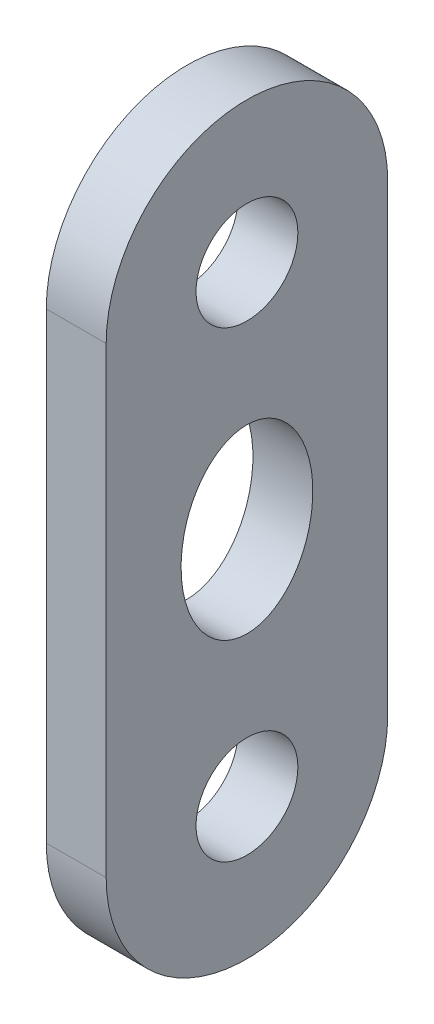
ISO-10303-21;
HEADER;
FILE_DESCRIPTION(('STEP AP214'),'2;1');
FILE_NAME('part.step','',(''),(''),'','','');
FILE_SCHEMA(('AUTOMOTIVE_DESIGN { 1 0 10303 214 1 1 1 1 }'));
ENDSEC;
DATA;
#1=APPLICATION_CONTEXT('core data for automotive mechanical design processes');
#2=APPLICATION_PROTOCOL_DEFINITION('international standard','automotive_design',2000,#1);
#3=PRODUCT_CONTEXT('',#1,'mechanical');
#4=PRODUCT('Part','Part','',(#3));
#5=PRODUCT_RELATED_PRODUCT_CATEGORY('part','',(#4));
#6=PRODUCT_DEFINITION_FORMATION('','',#4);
#7=PRODUCT_DEFINITION_CONTEXT('part definition',#1,'design');
#8=PRODUCT_DEFINITION('design','',#6,#7);
#9=PRODUCT_DEFINITION_SHAPE('','',#8);
#10=(LENGTH_UNIT() NAMED_UNIT(*) SI_UNIT(.MILLI.,.METRE.));
#11=(NAMED_UNIT(*) PLANE_ANGLE_UNIT() SI_UNIT($,.RADIAN.));
#12=(NAMED_UNIT(*) SI_UNIT($,.STERADIAN.) SOLID_ANGLE_UNIT());
#13=UNCERTAINTY_MEASURE_WITH_UNIT(LENGTH_MEASURE(1.E-05),#10,'distance_accuracy_value','');
#14=(GEOMETRIC_REPRESENTATION_CONTEXT(3) GLOBAL_UNCERTAINTY_ASSIGNED_CONTEXT((#13)) GLOBAL_UNIT_ASSIGNED_CONTEXT((#10,
#11,#12)) REPRESENTATION_CONTEXT('',''));
#15=CARTESIAN_POINT('',(0.,0.,0.));
#16=DIRECTION('',(0.,0.,1.));
#17=DIRECTION('',(1.,0.,0.));
#18=AXIS2_PLACEMENT_3D('',#15,#16,#17);
#19=CARTESIAN_POINT('',(2.,-15.4439297167024,0.));
#20=DIRECTION('',(1.,0.,0.));
#21=DIRECTION('',(0.,0.,-1.));
#22=AXIS2_PLACEMENT_3D('',#19,#20,#21);
#23=PLANE('',#22);
#24=CARTESIAN_POINT('',(2.,-7.72196485835122,0.));
#25=DIRECTION('',(1.,0.,0.));
#26=DIRECTION('',(0.,-1.,0.));
#27=AXIS2_PLACEMENT_3D('',#24,#25,#26);
#28=ELLIPSE('',#27,3.02196485835122,2.2);
#29=CARTESIAN_POINT('',(2.,-10.7439297167024,0.));
#30=VERTEX_POINT('',#29);
#31=EDGE_CURVE('E115',#30,#30,#28,.T.);
#32=ORIENTED_EDGE('',*,*,#31,.F.);
#33=EDGE_LOOP('',(#32));
#34=FACE_BOUND('',#33,.T.);
#35=CARTESIAN_POINT('',(2.,-15.4439297167024,0.));
#36=DIRECTION('',(1.,0.,0.));
#37=DIRECTION('',(0.,0.,-1.));
#38=AXIS2_PLACEMENT_3D('',#35,#36,#37);
#39=CIRCLE('',#38,4.7);
#40=CARTESIAN_POINT('',(2.,-15.4439297167024,4.7));
#41=VERTEX_POINT('',#40);
#42=CARTESIAN_POINT('',(2.,-15.4439297167024,-4.7));
#43=VERTEX_POINT('',#42);
#44=EDGE_CURVE('E85',#41,#43,#39,.T.);
#45=ORIENTED_EDGE('',*,*,#44,.T.);
#46=DIRECTION('',(0.,1.,0.));
#47=VECTOR('',#46,1.);
#48=CARTESIAN_POINT('',(2.,-15.4439297167024,-4.7));
#49=LINE('',#48,#47);
#50=CARTESIAN_POINT('',(2.,0.,-4.7));
#51=VERTEX_POINT('',#50);
#52=EDGE_CURVE('E80',#43,#51,#49,.T.);
#53=ORIENTED_EDGE('',*,*,#52,.T.);
#54=CARTESIAN_POINT('',(2.,0.,0.));
#55=DIRECTION('',(1.,0.,0.));
#56=DIRECTION('',(0.,0.,-1.));
#57=AXIS2_PLACEMENT_3D('',#54,#55,#56);
#58=CIRCLE('',#57,4.7);
#59=CARTESIAN_POINT('',(2.,0.,4.7));
#60=VERTEX_POINT('',#59);
#61=EDGE_CURVE('E83',#51,#60,#58,.T.);
#62=ORIENTED_EDGE('',*,*,#61,.T.);
#63=DIRECTION('',(0.,-1.,0.));
#64=VECTOR('',#63,1.);
#65=CARTESIAN_POINT('',(2.,-15.4439297167024,4.7));
#66=LINE('',#65,#64);
#67=EDGE_CURVE('E50',#60,#41,#66,.T.);
#68=ORIENTED_EDGE('',*,*,#67,.T.);
#69=EDGE_LOOP('',(#45,#53,#62,#68));
#70=FACE_BOUND('',#69,.T.);
#71=CARTESIAN_POINT('',(2.,0.,0.));
#72=DIRECTION('',(1.,0.,0.));
#73=DIRECTION('',(0.,0.,-1.));
#74=AXIS2_PLACEMENT_3D('',#71,#72,#73);
#75=CIRCLE('',#74,1.7);
#76=CARTESIAN_POINT('',(2.,0.,-1.7));
#77=VERTEX_POINT('',#76);
#78=EDGE_CURVE('E100',#77,#77,#75,.T.);
#79=ORIENTED_EDGE('',*,*,#78,.F.);
#80=EDGE_LOOP('',(#79));
#81=FACE_BOUND('',#80,.T.);
#82=CARTESIAN_POINT('',(2.,-15.4439297167024,0.));
#83=DIRECTION('',(1.,0.,0.));
#84=DIRECTION('',(0.,0.,-1.));
#85=AXIS2_PLACEMENT_3D('',#82,#83,#84);
#86=CIRCLE('',#85,1.7);
#87=CARTESIAN_POINT('',(2.,-15.4439297167024,-1.7));
#88=VERTEX_POINT('',#87);
#89=EDGE_CURVE('E121',#88,#88,#86,.T.);
#90=ORIENTED_EDGE('',*,*,#89,.F.);
#91=EDGE_LOOP('',(#90));
#92=FACE_BOUND('',#91,.T.);
#93=ADVANCED_FACE('F33',(#34,#70,#81,#92),#23,.T.);
#94=CARTESIAN_POINT('',(0.,-15.4439297167024,0.));
#95=DIRECTION('',(1.,0.,0.));
#96=DIRECTION('',(0.,0.,-1.));
#97=AXIS2_PLACEMENT_3D('',#94,#95,#96);
#98=PLANE('',#97);
#99=CARTESIAN_POINT('',(0.,-15.4439297167024,0.));
#100=DIRECTION('',(1.,0.,0.));
#101=DIRECTION('',(0.,0.,-1.));
#102=AXIS2_PLACEMENT_3D('',#99,#100,#101);
#103=CIRCLE('',#102,4.7);
#104=CARTESIAN_POINT('',(0.,-15.4439297167024,4.7));
#105=VERTEX_POINT('',#104);
#106=CARTESIAN_POINT('',(0.,-15.4439297167024,-4.7));
#107=VERTEX_POINT('',#106);
#108=EDGE_CURVE('E97',#105,#107,#103,.T.);
#109=ORIENTED_EDGE('',*,*,#108,.F.);
#110=DIRECTION('',(0.,-1.,0.));
#111=VECTOR('',#110,1.);
#112=CARTESIAN_POINT('',(0.,-15.4439297167024,4.7));
#113=LINE('',#112,#111);
#114=CARTESIAN_POINT('',(0.,0.,4.7));
#115=VERTEX_POINT('',#114);
#116=EDGE_CURVE('E73',#115,#105,#113,.T.);
#117=ORIENTED_EDGE('',*,*,#116,.F.);
#118=CARTESIAN_POINT('',(0.,0.,0.));
#119=DIRECTION('',(1.,0.,0.));
#120=DIRECTION('',(0.,0.,-1.));
#121=AXIS2_PLACEMENT_3D('',#118,#119,#120);
#122=CIRCLE('',#121,4.7);
#123=CARTESIAN_POINT('',(0.,0.,-4.7));
#124=VERTEX_POINT('',#123);
#125=EDGE_CURVE('E67',#124,#115,#122,.T.);
#126=ORIENTED_EDGE('',*,*,#125,.F.);
#127=DIRECTION('',(0.,1.,0.));
#128=VECTOR('',#127,1.);
#129=CARTESIAN_POINT('',(0.,-15.4439297167024,-4.7));
#130=LINE('',#129,#128);
#131=EDGE_CURVE('E89',#107,#124,#130,.T.);
#132=ORIENTED_EDGE('',*,*,#131,.F.);
#133=EDGE_LOOP('',(#109,#117,#126,#132));
#134=FACE_BOUND('',#133,.T.);
#135=CARTESIAN_POINT('',(0.,0.,0.));
#136=DIRECTION('',(1.,0.,0.));
#137=DIRECTION('',(0.,0.,-1.));
#138=AXIS2_PLACEMENT_3D('',#135,#136,#137);
#139=CIRCLE('',#138,1.7);
#140=CARTESIAN_POINT('',(0.,0.,-1.7));
#141=VERTEX_POINT('',#140);
#142=EDGE_CURVE('E112',#141,#141,#139,.T.);
#143=ORIENTED_EDGE('',*,*,#142,.T.);
#144=EDGE_LOOP('',(#143));
#145=FACE_BOUND('',#144,.T.);
#146=CARTESIAN_POINT('',(0.,-7.72196485835122,0.));
#147=DIRECTION('',(1.,0.,0.));
#148=DIRECTION('',(0.,-1.,0.));
#149=AXIS2_PLACEMENT_3D('',#146,#147,#148);
#150=ELLIPSE('',#149,3.02196485835122,2.2);
#151=CARTESIAN_POINT('',(0.,-10.7439297167024,0.));
#152=VERTEX_POINT('',#151);
#153=EDGE_CURVE('E118',#152,#152,#150,.T.);
#154=ORIENTED_EDGE('',*,*,#153,.T.);
#155=EDGE_LOOP('',(#154));
#156=FACE_BOUND('',#155,.T.);
#157=CARTESIAN_POINT('',(0.,-15.4439297167024,0.));
#158=DIRECTION('',(1.,0.,0.));
#159=DIRECTION('',(0.,0.,-1.));
#160=AXIS2_PLACEMENT_3D('',#157,#158,#159);
#161=CIRCLE('',#160,1.7);
#162=CARTESIAN_POINT('',(0.,-15.4439297167024,-1.7));
#163=VERTEX_POINT('',#162);
#164=EDGE_CURVE('E125',#163,#163,#161,.T.);
#165=ORIENTED_EDGE('',*,*,#164,.T.);
#166=EDGE_LOOP('',(#165));
#167=FACE_BOUND('',#166,.T.);
#168=ADVANCED_FACE('F108',(#134,#145,#156,#167),#98,.F.);
#169=CARTESIAN_POINT('',(2.,-15.4439297167024,0.));
#170=DIRECTION('',(-1.,0.,0.));
#171=DIRECTION('',(0.,0.,1.));
#172=AXIS2_PLACEMENT_3D('',#169,#170,#171);
#173=CYLINDRICAL_SURFACE('',#172,4.7);
#174=ORIENTED_EDGE('',*,*,#108,.T.);
#175=DIRECTION('',(-1.,0.,0.));
#176=VECTOR('',#175,1.);
#177=CARTESIAN_POINT('',(2.,-15.4439297167024,-4.7));
#178=LINE('',#177,#176);
#179=EDGE_CURVE('E11',#43,#107,#178,.T.);
#180=ORIENTED_EDGE('',*,*,#179,.F.);
#181=ORIENTED_EDGE('',*,*,#44,.F.);
#182=DIRECTION('',(-1.,0.,0.));
#183=VECTOR('',#182,1.);
#184=CARTESIAN_POINT('',(2.,-15.4439297167024,4.7));
#185=LINE('',#184,#183);
#186=EDGE_CURVE('E93',#41,#105,#185,.T.);
#187=ORIENTED_EDGE('',*,*,#186,.T.);
#188=EDGE_LOOP('',(#174,#180,#181,#187));
#189=FACE_BOUND('',#188,.T.);
#190=ADVANCED_FACE('F35',(#189),#173,.T.);
#191=CARTESIAN_POINT('',(2.,-15.4439297167024,-4.7));
#192=DIRECTION('',(0.,0.,1.));
#193=DIRECTION('',(1.,0.,0.));
#194=AXIS2_PLACEMENT_3D('',#191,#192,#193);
#195=PLANE('',#194);
#196=ORIENTED_EDGE('',*,*,#131,.T.);
#197=DIRECTION('',(-1.,0.,0.));
#198=VECTOR('',#197,1.);
#199=CARTESIAN_POINT('',(2.,0.,-4.7));
#200=LINE('',#199,#198);
#201=EDGE_CURVE('E42',#51,#124,#200,.T.);
#202=ORIENTED_EDGE('',*,*,#201,.F.);
#203=ORIENTED_EDGE('',*,*,#52,.F.);
#204=ORIENTED_EDGE('',*,*,#179,.T.);
#205=EDGE_LOOP('',(#196,#202,#203,#204));
#206=FACE_BOUND('',#205,.T.);
#207=ADVANCED_FACE('F88',(#206),#195,.F.);
#208=CARTESIAN_POINT('',(2.,0.,0.));
#209=DIRECTION('',(-1.,0.,0.));
#210=DIRECTION('',(0.,0.,1.));
#211=AXIS2_PLACEMENT_3D('',#208,#209,#210);
#212=CYLINDRICAL_SURFACE('',#211,4.7);
#213=ORIENTED_EDGE('',*,*,#125,.T.);
#214=DIRECTION('',(-1.,0.,0.));
#215=VECTOR('',#214,1.);
#216=CARTESIAN_POINT('',(2.,0.,4.7));
#217=LINE('',#216,#215);
#218=EDGE_CURVE('E90',#60,#115,#217,.T.);
#219=ORIENTED_EDGE('',*,*,#218,.F.);
#220=ORIENTED_EDGE('',*,*,#61,.F.);
#221=ORIENTED_EDGE('',*,*,#201,.T.);
#222=EDGE_LOOP('',(#213,#219,#220,#221));
#223=FACE_BOUND('',#222,.T.);
#224=ADVANCED_FACE('F91',(#223),#212,.T.);
#225=CARTESIAN_POINT('',(2.,-15.4439297167024,4.7));
#226=DIRECTION('',(0.,0.,-1.));
#227=DIRECTION('',(-1.,0.,0.));
#228=AXIS2_PLACEMENT_3D('',#225,#226,#227);
#229=PLANE('',#228);
#230=ORIENTED_EDGE('',*,*,#116,.T.);
#231=ORIENTED_EDGE('',*,*,#186,.F.);
#232=ORIENTED_EDGE('',*,*,#67,.F.);
#233=ORIENTED_EDGE('',*,*,#218,.T.);
#234=EDGE_LOOP('',(#230,#231,#232,#233));
#235=FACE_BOUND('',#234,.T.);
#236=ADVANCED_FACE('F105',(#235),#229,.F.);
#237=CARTESIAN_POINT('',(2.,0.,0.));
#238=DIRECTION('',(-1.,0.,0.));
#239=DIRECTION('',(0.,0.,1.));
#240=AXIS2_PLACEMENT_3D('',#237,#238,#239);
#241=CYLINDRICAL_SURFACE('',#240,1.7);
#242=ORIENTED_EDGE('',*,*,#78,.T.);
#243=EDGE_LOOP('',(#242));
#244=FACE_BOUND('',#243,.T.);
#245=ORIENTED_EDGE('',*,*,#142,.F.);
#246=EDGE_LOOP('',(#245));
#247=FACE_BOUND('',#246,.T.);
#248=ADVANCED_FACE('F133',(#244,#247),#241,.F.);
#249=DIRECTION('',(-1.,0.,0.));
#250=VECTOR('',#249,1.);
#251=SURFACE_OF_LINEAR_EXTRUSION('',#28,#250);
#252=ORIENTED_EDGE('',*,*,#31,.T.);
#253=EDGE_LOOP('',(#252));
#254=FACE_BOUND('',#253,.T.);
#255=ORIENTED_EDGE('',*,*,#153,.F.);
#256=EDGE_LOOP('',(#255));
#257=FACE_BOUND('',#256,.T.);
#258=ADVANCED_FACE('F128',(#254,#257),#251,.T.);
#259=CARTESIAN_POINT('',(2.,-15.4439297167024,0.));
#260=DIRECTION('',(-1.,0.,0.));
#261=DIRECTION('',(0.,0.,1.));
#262=AXIS2_PLACEMENT_3D('',#259,#260,#261);
#263=CYLINDRICAL_SURFACE('',#262,1.7);
#264=ORIENTED_EDGE('',*,*,#89,.T.);
#265=EDGE_LOOP('',(#264));
#266=FACE_BOUND('',#265,.T.);
#267=ORIENTED_EDGE('',*,*,#164,.F.);
#268=EDGE_LOOP('',(#267));
#269=FACE_BOUND('',#268,.T.);
#270=ADVANCED_FACE('F132',(#266,#269),#263,.F.);
#271=CLOSED_SHELL('',(#93,#168,#190,#207,#224,#236,#248,#258,#270));
#272=MANIFOLD_SOLID_BREP('B2',#271);
#273=ADVANCED_BREP_SHAPE_REPRESENTATION('',(#18,#272),#14);
#274=SHAPE_DEFINITION_REPRESENTATION(#9,#273);
ENDSEC;
END-ISO-10303-21;
